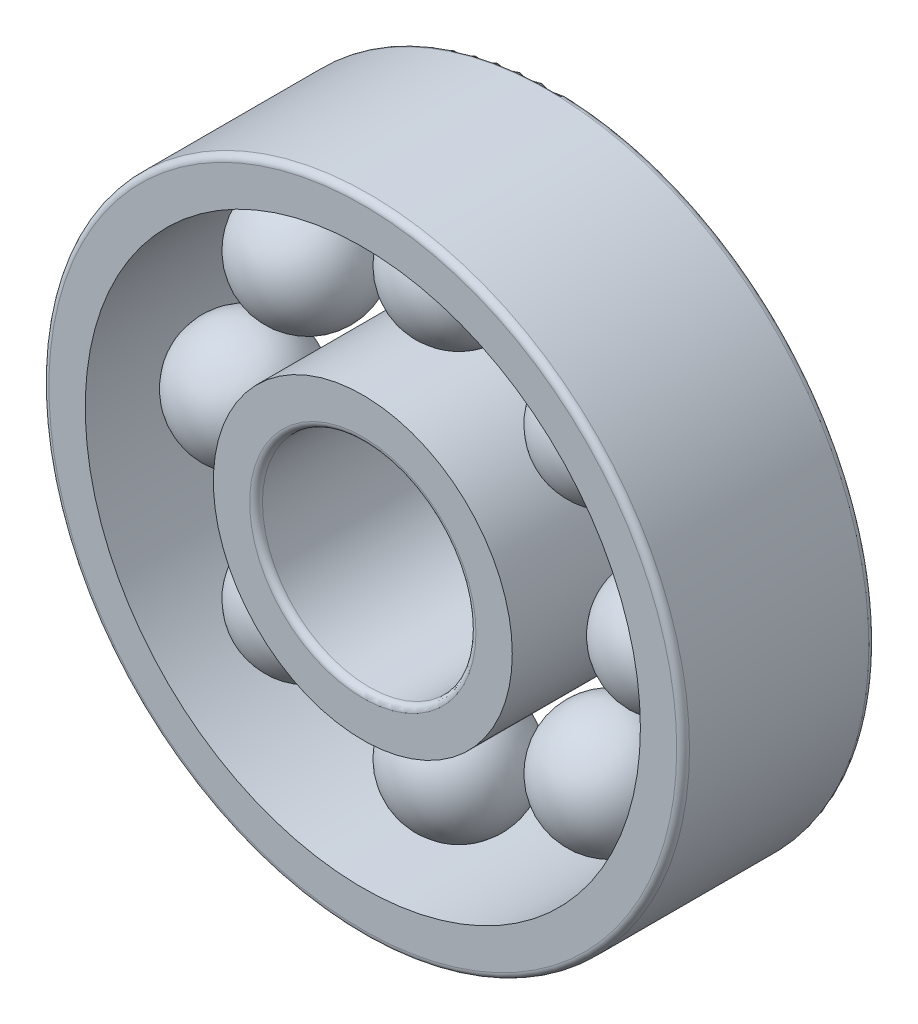
ISO-10303-21;
HEADER;
FILE_DESCRIPTION(('STEP AP214'),'2;1');
FILE_NAME('part.step','',(''),(''),'','','');
FILE_SCHEMA(('AUTOMOTIVE_DESIGN { 1 0 10303 214 1 1 1 1 }'));
ENDSEC;
DATA;
#1=APPLICATION_CONTEXT('core data for automotive mechanical design processes');
#2=APPLICATION_PROTOCOL_DEFINITION('international standard','automotive_design',2000,#1);
#3=PRODUCT_CONTEXT('',#1,'mechanical');
#4=PRODUCT('Part','Part','',(#3));
#5=PRODUCT_RELATED_PRODUCT_CATEGORY('part','',(#4));
#6=PRODUCT_DEFINITION_FORMATION('','',#4);
#7=PRODUCT_DEFINITION_CONTEXT('part definition',#1,'design');
#8=PRODUCT_DEFINITION('design','',#6,#7);
#9=PRODUCT_DEFINITION_SHAPE('','',#8);
#10=(LENGTH_UNIT() NAMED_UNIT(*) SI_UNIT(.MILLI.,.METRE.));
#11=(NAMED_UNIT(*) PLANE_ANGLE_UNIT() SI_UNIT($,.RADIAN.));
#12=(NAMED_UNIT(*) SI_UNIT($,.STERADIAN.) SOLID_ANGLE_UNIT());
#13=UNCERTAINTY_MEASURE_WITH_UNIT(LENGTH_MEASURE(1.E-05),#10,'distance_accuracy_value','');
#14=(GEOMETRIC_REPRESENTATION_CONTEXT(3) GLOBAL_UNCERTAINTY_ASSIGNED_CONTEXT((#13)) GLOBAL_UNIT_ASSIGNED_CONTEXT((#10,
#11,#12)) REPRESENTATION_CONTEXT('',''));
#15=CARTESIAN_POINT('',(0.,0.,0.));
#16=DIRECTION('',(0.,0.,1.));
#17=DIRECTION('',(1.,0.,0.));
#18=AXIS2_PLACEMENT_3D('',#15,#16,#17);
#19=CARTESIAN_POINT('',(7.07106781186547,-7.07106781186548,0.));
#20=DIRECTION('',(-0.707106781186547,0.707106781186548,0.));
#21=DIRECTION('',(0.,0.,-1.));
#22=AXIS2_PLACEMENT_3D('',#19,#20,#21);
#23=SPHERICAL_SURFACE('',#22,2.85);
#24=CARTESIAN_POINT('',(5.05581348548381,-5.05581348548382,0.));
#25=VERTEX_POINT('',#24);
#26=VERTEX_LOOP('',#25);
#27=FACE_BOUND('',#26,.T.);
#28=ADVANCED_FACE('F38',(#27),#23,.T.);
#29=CLOSED_SHELL('',(#28));
#30=MANIFOLD_SOLID_BREP('B2',#29);
#31=CARTESIAN_POINT('',(0.,-10.,0.));
#32=DIRECTION('',(0.,1.,0.));
#33=DIRECTION('',(0.,0.,-1.));
#34=AXIS2_PLACEMENT_3D('',#31,#32,#33);
#35=SPHERICAL_SURFACE('',#34,2.85);
#36=CARTESIAN_POINT('',(0.,-7.15,0.));
#37=VERTEX_POINT('',#36);
#38=VERTEX_LOOP('',#37);
#39=FACE_BOUND('',#38,.T.);
#40=ADVANCED_FACE('F57',(#39),#35,.T.);
#41=CLOSED_SHELL('',(#40));
#42=MANIFOLD_SOLID_BREP('B6',#41);
#43=CARTESIAN_POINT('',(-7.07106781186548,-7.07106781186547,0.));
#44=DIRECTION('',(0.707106781186548,0.707106781186547,0.));
#45=DIRECTION('',(0.,0.,-1.));
#46=AXIS2_PLACEMENT_3D('',#43,#44,#45);
#47=SPHERICAL_SURFACE('',#46,2.85);
#48=CARTESIAN_POINT('',(-5.05581348548382,-5.05581348548381,0.));
#49=VERTEX_POINT('',#48);
#50=VERTEX_LOOP('',#49);
#51=FACE_BOUND('',#50,.T.);
#52=ADVANCED_FACE('F76',(#51),#47,.T.);
#53=CLOSED_SHELL('',(#52));
#54=MANIFOLD_SOLID_BREP('B34',#53);
#55=CARTESIAN_POINT('',(-10.,0.,0.));
#56=DIRECTION('',(1.,0.,0.));
#57=DIRECTION('',(0.,0.,-1.));
#58=AXIS2_PLACEMENT_3D('',#55,#56,#57);
#59=SPHERICAL_SURFACE('',#58,2.85);
#60=CARTESIAN_POINT('',(-7.15,0.,0.));
#61=VERTEX_POINT('',#60);
#62=VERTEX_LOOP('',#61);
#63=FACE_BOUND('',#62,.T.);
#64=ADVANCED_FACE('F95',(#63),#59,.T.);
#65=CLOSED_SHELL('',(#64));
#66=MANIFOLD_SOLID_BREP('B53',#65);
#67=CARTESIAN_POINT('',(-7.07106781186547,7.07106781186548,0.));
#68=DIRECTION('',(0.707106781186547,-0.707106781186548,0.));
#69=DIRECTION('',(0.,0.,-1.));
#70=AXIS2_PLACEMENT_3D('',#67,#68,#69);
#71=SPHERICAL_SURFACE('',#70,2.85);
#72=CARTESIAN_POINT('',(-5.05581348548381,5.05581348548382,0.));
#73=VERTEX_POINT('',#72);
#74=VERTEX_LOOP('',#73);
#75=FACE_BOUND('',#74,.T.);
#76=ADVANCED_FACE('F114',(#75),#71,.T.);
#77=CLOSED_SHELL('',(#76));
#78=MANIFOLD_SOLID_BREP('B72',#77);
#79=CARTESIAN_POINT('',(0.,10.,0.));
#80=DIRECTION('',(0.,-1.,0.));
#81=DIRECTION('',(0.,0.,-1.));
#82=AXIS2_PLACEMENT_3D('',#79,#80,#81);
#83=SPHERICAL_SURFACE('',#82,2.85);
#84=CARTESIAN_POINT('',(0.,7.15,0.));
#85=VERTEX_POINT('',#84);
#86=VERTEX_LOOP('',#85);
#87=FACE_BOUND('',#86,.T.);
#88=ADVANCED_FACE('F133',(#87),#83,.T.);
#89=CLOSED_SHELL('',(#88));
#90=MANIFOLD_SOLID_BREP('B91',#89);
#91=CARTESIAN_POINT('',(7.07106781186548,7.07106781186548,0.));
#92=DIRECTION('',(-0.707106781186548,-0.707106781186548,0.));
#93=DIRECTION('',(0.,0.,-1.));
#94=AXIS2_PLACEMENT_3D('',#91,#92,#93);
#95=SPHERICAL_SURFACE('',#94,2.85);
#96=CARTESIAN_POINT('',(5.05581348548382,5.05581348548382,0.));
#97=VERTEX_POINT('',#96);
#98=VERTEX_LOOP('',#97);
#99=FACE_BOUND('',#98,.T.);
#100=ADVANCED_FACE('F152',(#99),#95,.T.);
#101=CLOSED_SHELL('',(#100));
#102=MANIFOLD_SOLID_BREP('B110',#101);
#103=CARTESIAN_POINT('',(10.,0.,0.));
#104=DIRECTION('',(-1.,0.,0.));
#105=DIRECTION('',(0.,0.,-1.));
#106=AXIS2_PLACEMENT_3D('',#103,#104,#105);
#107=SPHERICAL_SURFACE('',#106,2.85);
#108=CARTESIAN_POINT('',(7.15,0.,0.));
#109=VERTEX_POINT('',#108);
#110=VERTEX_LOOP('',#109);
#111=FACE_BOUND('',#110,.T.);
#112=ADVANCED_FACE('F173',(#111),#107,.T.);
#113=CLOSED_SHELL('',(#112));
#114=MANIFOLD_SOLID_BREP('B129',#113);
#115=CARTESIAN_POINT('',(0.,0.,7.75));
#116=DIRECTION('',(0.,0.,1.));
#117=DIRECTION('',(1.,0.,0.));
#118=AXIS2_PLACEMENT_3D('',#115,#116,#117);
#119=CYLINDRICAL_SURFACE('',#118,13.);
#120=CARTESIAN_POINT('',(0.,0.,4.5));
#121=DIRECTION('',(0.,0.,1.));
#122=DIRECTION('',(1.,0.,0.));
#123=AXIS2_PLACEMENT_3D('',#120,#121,#122);
#124=CIRCLE('',#123,13.);
#125=CARTESIAN_POINT('',(13.,0.,4.5));
#126=VERTEX_POINT('',#125);
#127=EDGE_CURVE('E213',#126,#126,#124,.T.);
#128=ORIENTED_EDGE('',*,*,#127,.T.);
#129=EDGE_LOOP('',(#128));
#130=FACE_BOUND('',#129,.T.);
#131=CARTESIAN_POINT('',(0.,0.,-4.5));
#132=DIRECTION('',(0.,0.,1.));
#133=DIRECTION('',(1.,0.,0.));
#134=AXIS2_PLACEMENT_3D('',#131,#132,#133);
#135=CIRCLE('',#134,13.);
#136=CARTESIAN_POINT('',(13.,0.,-4.5));
#137=VERTEX_POINT('',#136);
#138=EDGE_CURVE('E216',#137,#137,#135,.T.);
#139=ORIENTED_EDGE('',*,*,#138,.F.);
#140=EDGE_LOOP('',(#139));
#141=FACE_BOUND('',#140,.T.);
#142=ADVANCED_FACE('F193',(#130,#141),#119,.F.);
#143=CARTESIAN_POINT('',(13.,0.,4.5));
#144=DIRECTION('',(0.,0.,1.));
#145=DIRECTION('',(1.,0.,0.));
#146=AXIS2_PLACEMENT_3D('',#143,#144,#145);
#147=PLANE('',#146);
#148=CARTESIAN_POINT('',(0.,0.,4.5));
#149=DIRECTION('',(0.,0.,1.));
#150=DIRECTION('',(1.,0.,0.));
#151=AXIS2_PLACEMENT_3D('',#148,#149,#150);
#152=CIRCLE('',#151,14.7);
#153=CARTESIAN_POINT('',(14.7,0.,4.5));
#154=VERTEX_POINT('',#153);
#155=EDGE_CURVE('E172',#154,#154,#152,.T.);
#156=ORIENTED_EDGE('',*,*,#155,.T.);
#157=EDGE_LOOP('',(#156));
#158=FACE_BOUND('',#157,.T.);
#159=ORIENTED_EDGE('',*,*,#127,.F.);
#160=EDGE_LOOP('',(#159));
#161=FACE_BOUND('',#160,.T.);
#162=ADVANCED_FACE('F223',(#158,#161),#147,.T.);
#163=CARTESIAN_POINT('',(0.,0.,7.75));
#164=DIRECTION('',(0.,0.,1.));
#165=DIRECTION('',(1.,0.,0.));
#166=AXIS2_PLACEMENT_3D('',#163,#164,#165);
#167=CYLINDRICAL_SURFACE('',#166,15.);
#168=CARTESIAN_POINT('',(0.,0.,-4.2));
#169=DIRECTION('',(0.,0.,-1.));
#170=DIRECTION('',(-1.,0.,0.));
#171=AXIS2_PLACEMENT_3D('',#168,#169,#170);
#172=CIRCLE('',#171,15.);
#173=CARTESIAN_POINT('',(-15.,0.,-4.2));
#174=VERTEX_POINT('',#173);
#175=EDGE_CURVE('E204',#174,#174,#172,.F.);
#176=ORIENTED_EDGE('',*,*,#175,.T.);
#177=EDGE_LOOP('',(#176));
#178=FACE_BOUND('',#177,.T.);
#179=CARTESIAN_POINT('',(0.,0.,4.2));
#180=DIRECTION('',(0.,0.,1.));
#181=DIRECTION('',(1.,0.,0.));
#182=AXIS2_PLACEMENT_3D('',#179,#180,#181);
#183=CIRCLE('',#182,15.);
#184=CARTESIAN_POINT('',(15.,0.,4.2));
#185=VERTEX_POINT('',#184);
#186=EDGE_CURVE('E208',#185,#185,#183,.F.);
#187=ORIENTED_EDGE('',*,*,#186,.T.);
#188=EDGE_LOOP('',(#187));
#189=FACE_BOUND('',#188,.T.);
#190=ADVANCED_FACE('F229',(#178,#189),#167,.T.);
#191=CARTESIAN_POINT('',(15.,0.,-4.5));
#192=DIRECTION('',(0.,0.,-1.));
#193=DIRECTION('',(-1.,0.,0.));
#194=AXIS2_PLACEMENT_3D('',#191,#192,#193);
#195=PLANE('',#194);
#196=CARTESIAN_POINT('',(0.,0.,-4.5));
#197=DIRECTION('',(0.,0.,-1.));
#198=DIRECTION('',(-1.,0.,0.));
#199=AXIS2_PLACEMENT_3D('',#196,#197,#198);
#200=CIRCLE('',#199,14.7);
#201=CARTESIAN_POINT('',(-14.7,0.,-4.5));
#202=VERTEX_POINT('',#201);
#203=EDGE_CURVE('E200',#202,#202,#200,.T.);
#204=ORIENTED_EDGE('',*,*,#203,.T.);
#205=EDGE_LOOP('',(#204));
#206=FACE_BOUND('',#205,.T.);
#207=ORIENTED_EDGE('',*,*,#138,.T.);
#208=EDGE_LOOP('',(#207));
#209=FACE_BOUND('',#208,.T.);
#210=ADVANCED_FACE('F220',(#206,#209),#195,.T.);
#211=CARTESIAN_POINT('',(0.,0.,-4.2));
#212=DIRECTION('',(0.,0.,-1.));
#213=DIRECTION('',(-1.,0.,0.));
#214=AXIS2_PLACEMENT_3D('',#211,#212,#213);
#215=TOROIDAL_SURFACE('',#214,14.7,0.3);
#216=ORIENTED_EDGE('',*,*,#203,.F.);
#217=EDGE_LOOP('',(#216));
#218=FACE_BOUND('',#217,.T.);
#219=ORIENTED_EDGE('',*,*,#175,.F.);
#220=EDGE_LOOP('',(#219));
#221=FACE_BOUND('',#220,.T.);
#222=ADVANCED_FACE('F232',(#218,#221),#215,.T.);
#223=CARTESIAN_POINT('',(0.,0.,4.2));
#224=DIRECTION('',(0.,0.,1.));
#225=DIRECTION('',(1.,0.,0.));
#226=AXIS2_PLACEMENT_3D('',#223,#224,#225);
#227=TOROIDAL_SURFACE('',#226,14.7,0.3);
#228=ORIENTED_EDGE('',*,*,#186,.F.);
#229=EDGE_LOOP('',(#228));
#230=FACE_BOUND('',#229,.T.);
#231=ORIENTED_EDGE('',*,*,#155,.F.);
#232=EDGE_LOOP('',(#231));
#233=FACE_BOUND('',#232,.T.);
#234=ADVANCED_FACE('F195',(#230,#233),#227,.T.);
#235=CLOSED_SHELL('',(#142,#162,#190,#210,#222,#234));
#236=MANIFOLD_SOLID_BREP('B148',#235);
#237=CARTESIAN_POINT('',(0.,0.,7.75));
#238=DIRECTION('',(0.,0.,1.));
#239=DIRECTION('',(1.,0.,0.));
#240=AXIS2_PLACEMENT_3D('',#237,#238,#239);
#241=CYLINDRICAL_SURFACE('',#240,5.);
#242=CARTESIAN_POINT('',(0.,0.,-4.2));
#243=DIRECTION('',(0.,0.,-1.));
#244=DIRECTION('',(-1.,0.,0.));
#245=AXIS2_PLACEMENT_3D('',#242,#243,#244);
#246=CIRCLE('',#245,5.);
#247=CARTESIAN_POINT('',(-5.,0.,-4.2));
#248=VERTEX_POINT('',#247);
#249=EDGE_CURVE('E292',#248,#248,#246,.T.);
#250=ORIENTED_EDGE('',*,*,#249,.T.);
#251=EDGE_LOOP('',(#250));
#252=FACE_BOUND('',#251,.T.);
#253=CARTESIAN_POINT('',(0.,0.,4.2));
#254=DIRECTION('',(0.,0.,1.));
#255=DIRECTION('',(1.,0.,0.));
#256=AXIS2_PLACEMENT_3D('',#253,#254,#255);
#257=CIRCLE('',#256,5.);
#258=CARTESIAN_POINT('',(5.,0.,4.2));
#259=VERTEX_POINT('',#258);
#260=EDGE_CURVE('E296',#259,#259,#257,.T.);
#261=ORIENTED_EDGE('',*,*,#260,.T.);
#262=EDGE_LOOP('',(#261));
#263=FACE_BOUND('',#262,.T.);
#264=ADVANCED_FACE('F285',(#252,#263),#241,.F.);
#265=CARTESIAN_POINT('',(5.,0.,4.5));
#266=DIRECTION('',(0.,0.,1.));
#267=DIRECTION('',(1.,0.,0.));
#268=AXIS2_PLACEMENT_3D('',#265,#266,#267);
#269=PLANE('',#268);
#270=CARTESIAN_POINT('',(0.,0.,4.5));
#271=DIRECTION('',(0.,0.,1.));
#272=DIRECTION('',(1.,0.,0.));
#273=AXIS2_PLACEMENT_3D('',#270,#271,#272);
#274=CIRCLE('',#273,5.3);
#275=CARTESIAN_POINT('',(5.3,0.,4.5));
#276=VERTEX_POINT('',#275);
#277=EDGE_CURVE('E192',#276,#276,#274,.F.);
#278=ORIENTED_EDGE('',*,*,#277,.T.);
#279=EDGE_LOOP('',(#278));
#280=FACE_BOUND('',#279,.T.);
#281=CARTESIAN_POINT('',(0.,0.,4.5));
#282=DIRECTION('',(0.,0.,1.));
#283=DIRECTION('',(1.,0.,0.));
#284=AXIS2_PLACEMENT_3D('',#281,#282,#283);
#285=CIRCLE('',#284,7.);
#286=CARTESIAN_POINT('',(7.,0.,4.5));
#287=VERTEX_POINT('',#286);
#288=EDGE_CURVE('E305',#287,#287,#285,.T.);
#289=ORIENTED_EDGE('',*,*,#288,.T.);
#290=EDGE_LOOP('',(#289));
#291=FACE_BOUND('',#290,.T.);
#292=ADVANCED_FACE('F325',(#280,#291),#269,.T.);
#293=CARTESIAN_POINT('',(0.,0.,7.75));
#294=DIRECTION('',(0.,0.,1.));
#295=DIRECTION('',(1.,0.,0.));
#296=AXIS2_PLACEMENT_3D('',#293,#294,#295);
#297=CYLINDRICAL_SURFACE('',#296,7.);
#298=CARTESIAN_POINT('',(0.,0.,-4.5));
#299=DIRECTION('',(0.,0.,1.));
#300=DIRECTION('',(1.,0.,0.));
#301=AXIS2_PLACEMENT_3D('',#298,#299,#300);
#302=CIRCLE('',#301,7.);
#303=CARTESIAN_POINT('',(7.,0.,-4.5));
#304=VERTEX_POINT('',#303);
#305=EDGE_CURVE('E308',#304,#304,#302,.T.);
#306=ORIENTED_EDGE('',*,*,#305,.T.);
#307=EDGE_LOOP('',(#306));
#308=FACE_BOUND('',#307,.T.);
#309=ORIENTED_EDGE('',*,*,#288,.F.);
#310=EDGE_LOOP('',(#309));
#311=FACE_BOUND('',#310,.T.);
#312=ADVANCED_FACE('F312',(#308,#311),#297,.T.);
#313=CARTESIAN_POINT('',(7.,0.,-4.5));
#314=DIRECTION('',(0.,0.,-1.));
#315=DIRECTION('',(-1.,0.,0.));
#316=AXIS2_PLACEMENT_3D('',#313,#314,#315);
#317=PLANE('',#316);
#318=CARTESIAN_POINT('',(0.,0.,-4.5));
#319=DIRECTION('',(0.,0.,-1.));
#320=DIRECTION('',(-1.,0.,0.));
#321=AXIS2_PLACEMENT_3D('',#318,#319,#320);
#322=CIRCLE('',#321,5.3);
#323=CARTESIAN_POINT('',(-5.3,0.,-4.5));
#324=VERTEX_POINT('',#323);
#325=EDGE_CURVE('E300',#324,#324,#322,.F.);
#326=ORIENTED_EDGE('',*,*,#325,.T.);
#327=EDGE_LOOP('',(#326));
#328=FACE_BOUND('',#327,.T.);
#329=ORIENTED_EDGE('',*,*,#305,.F.);
#330=EDGE_LOOP('',(#329));
#331=FACE_BOUND('',#330,.T.);
#332=ADVANCED_FACE('F315',(#328,#331),#317,.T.);
#333=CARTESIAN_POINT('',(0.,0.,-4.2));
#334=DIRECTION('',(0.,0.,-1.));
#335=DIRECTION('',(-1.,0.,0.));
#336=AXIS2_PLACEMENT_3D('',#333,#334,#335);
#337=TOROIDAL_SURFACE('',#336,5.3,0.3);
#338=ORIENTED_EDGE('',*,*,#249,.F.);
#339=EDGE_LOOP('',(#338));
#340=FACE_BOUND('',#339,.T.);
#341=ORIENTED_EDGE('',*,*,#325,.F.);
#342=EDGE_LOOP('',(#341));
#343=FACE_BOUND('',#342,.T.);
#344=ADVANCED_FACE('F317',(#340,#343),#337,.T.);
#345=CARTESIAN_POINT('',(0.,0.,4.2));
#346=DIRECTION('',(0.,0.,1.));
#347=DIRECTION('',(1.,0.,0.));
#348=AXIS2_PLACEMENT_3D('',#345,#346,#347);
#349=TOROIDAL_SURFACE('',#348,5.3,0.3);
#350=ORIENTED_EDGE('',*,*,#277,.F.);
#351=EDGE_LOOP('',(#350));
#352=FACE_BOUND('',#351,.T.);
#353=ORIENTED_EDGE('',*,*,#260,.F.);
#354=EDGE_LOOP('',(#353));
#355=FACE_BOUND('',#354,.T.);
#356=ADVANCED_FACE('F287',(#352,#355),#349,.T.);
#357=CLOSED_SHELL('',(#264,#292,#312,#332,#344,#356));
#358=MANIFOLD_SOLID_BREP('B167',#357);
#359=ADVANCED_BREP_SHAPE_REPRESENTATION('',(#18,#30,#42,#54,#66,#78,#90,#102,#114,#236,#358),#14);
#360=SHAPE_DEFINITION_REPRESENTATION(#9,#359);
ENDSEC;
END-ISO-10303-21;
